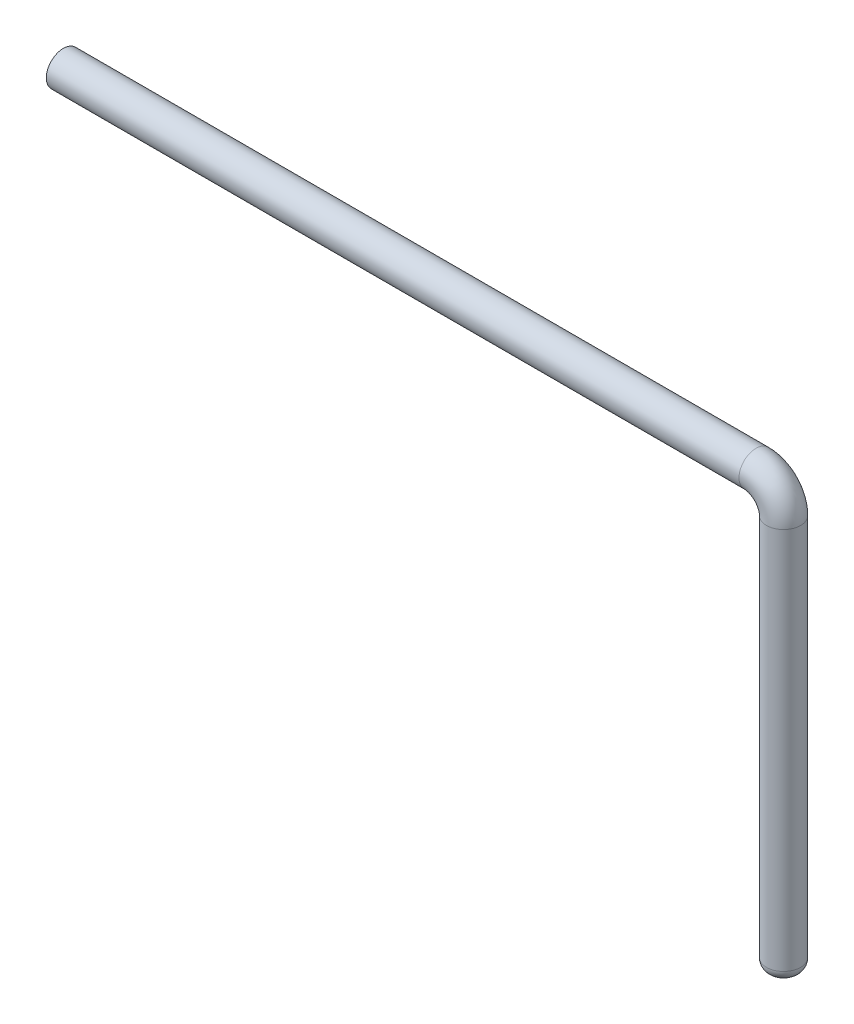
ISO-10303-21;
HEADER;
FILE_DESCRIPTION(('STEP AP214'),'2;1');
FILE_NAME('part.step','',(''),(''),'','','');
FILE_SCHEMA(('AUTOMOTIVE_DESIGN { 1 0 10303 214 1 1 1 1 }'));
ENDSEC;
DATA;
#1=APPLICATION_CONTEXT('core data for automotive mechanical design processes');
#2=APPLICATION_PROTOCOL_DEFINITION('international standard','automotive_design',2000,#1);
#3=PRODUCT_CONTEXT('',#1,'mechanical');
#4=PRODUCT('Part','Part','',(#3));
#5=PRODUCT_RELATED_PRODUCT_CATEGORY('part','',(#4));
#6=PRODUCT_DEFINITION_FORMATION('','',#4);
#7=PRODUCT_DEFINITION_CONTEXT('part definition',#1,'design');
#8=PRODUCT_DEFINITION('design','',#6,#7);
#9=PRODUCT_DEFINITION_SHAPE('','',#8);
#10=(LENGTH_UNIT() NAMED_UNIT(*) SI_UNIT(.MILLI.,.METRE.));
#11=(NAMED_UNIT(*) PLANE_ANGLE_UNIT() SI_UNIT($,.RADIAN.));
#12=(NAMED_UNIT(*) SI_UNIT($,.STERADIAN.) SOLID_ANGLE_UNIT());
#13=UNCERTAINTY_MEASURE_WITH_UNIT(LENGTH_MEASURE(1.E-05),#10,'distance_accuracy_value','');
#14=(GEOMETRIC_REPRESENTATION_CONTEXT(3) GLOBAL_UNCERTAINTY_ASSIGNED_CONTEXT((#13)) GLOBAL_UNIT_ASSIGNED_CONTEXT((#10,
#11,#12)) REPRESENTATION_CONTEXT('',''));
#15=CARTESIAN_POINT('',(0.,0.,0.));
#16=DIRECTION('',(0.,0.,1.));
#17=DIRECTION('',(1.,0.,0.));
#18=AXIS2_PLACEMENT_3D('',#15,#16,#17);
#19=CARTESIAN_POINT('',(51.4228571428571,34.0647619047619,0.));
#20=DIRECTION('',(-1.,0.,0.));
#21=DIRECTION('',(0.,0.,1.));
#22=AXIS2_PLACEMENT_3D('',#19,#20,#21);
#23=PLANE('',#22);
#24=CARTESIAN_POINT('',(51.4228571428571,34.0647619047619,0.));
#25=DIRECTION('',(-1.,0.,0.));
#26=DIRECTION('',(0.,0.,1.));
#27=AXIS2_PLACEMENT_3D('',#24,#25,#26);
#28=CIRCLE('',#27,0.310000000000005);
#29=CARTESIAN_POINT('',(51.4228571428571,34.0647619047619,0.310000000000005));
#30=VERTEX_POINT('',#29);
#31=EDGE_CURVE('E67',#30,#30,#28,.T.);
#32=ORIENTED_EDGE('',*,*,#31,.T.);
#33=EDGE_LOOP('',(#32));
#34=FACE_BOUND('',#33,.T.);
#35=ADVANCED_FACE('F47',(#34),#23,.T.);
#36=CARTESIAN_POINT('',(64.5028571428571,26.4147619047619,0.));
#37=DIRECTION('',(0.,1.,0.));
#38=DIRECTION('',(0.,0.,1.));
#39=AXIS2_PLACEMENT_3D('',#36,#37,#38);
#40=PLANE('',#39);
#41=CARTESIAN_POINT('',(64.5028571428571,26.4147619047619,0.));
#42=DIRECTION('',(0.,1.,0.));
#43=DIRECTION('',(0.,0.,1.));
#44=AXIS2_PLACEMENT_3D('',#41,#42,#43);
#45=CIRCLE('',#44,0.110000000000005);
#46=CARTESIAN_POINT('',(64.5028571428571,26.4147619047619,0.110000000000005));
#47=VERTEX_POINT('',#46);
#48=EDGE_CURVE('E11',#47,#47,#45,.F.);
#49=ORIENTED_EDGE('',*,*,#48,.T.);
#50=EDGE_LOOP('',(#49));
#51=FACE_BOUND('',#50,.T.);
#52=ADVANCED_FACE('F75',(#51),#40,.F.);
#53=CARTESIAN_POINT('',(51.4228571428571,34.0647619047619,0.));
#54=DIRECTION('',(1.,0.,0.));
#55=DIRECTION('',(0.,0.,-1.));
#56=AXIS2_PLACEMENT_3D('',#53,#54,#55);
#57=CYLINDRICAL_SURFACE('',#56,0.310000000000005);
#58=CARTESIAN_POINT('',(64.0028571428571,34.0647619047619,0.));
#59=DIRECTION('',(-1.,0.,0.));
#60=DIRECTION('',(0.,0.,1.));
#61=AXIS2_PLACEMENT_3D('',#58,#59,#60);
#62=CIRCLE('',#61,0.310000000000005);
#63=CARTESIAN_POINT('',(64.0028571428571,34.3747619047619,0.));
#64=VERTEX_POINT('',#63);
#65=EDGE_CURVE('E62',#64,#64,#62,.T.);
#66=ORIENTED_EDGE('',*,*,#65,.T.);
#67=EDGE_LOOP('',(#66));
#68=FACE_BOUND('',#67,.T.);
#69=ORIENTED_EDGE('',*,*,#31,.F.);
#70=EDGE_LOOP('',(#69));
#71=FACE_BOUND('',#70,.T.);
#72=ADVANCED_FACE('F72',(#68,#71),#57,.T.);
#73=CARTESIAN_POINT('',(64.0028571428571,33.5647619047619,0.));
#74=DIRECTION('',(0.,0.,-1.));
#75=DIRECTION('',(-1.,0.,0.));
#76=AXIS2_PLACEMENT_3D('',#73,#74,#75);
#77=TOROIDAL_SURFACE('',#76,0.5,0.310000000000005);
#78=CARTESIAN_POINT('',(64.5028571428571,33.5647619047619,0.));
#79=DIRECTION('',(0.,1.,0.));
#80=DIRECTION('',(0.,0.,1.));
#81=AXIS2_PLACEMENT_3D('',#78,#79,#80);
#82=CIRCLE('',#81,0.310000000000005);
#83=CARTESIAN_POINT('',(64.8128571428571,33.5647619047619,0.));
#84=VERTEX_POINT('',#83);
#85=EDGE_CURVE('E58',#84,#84,#82,.T.);
#86=CARTESIAN_POINT('',(64.0028571428571,33.5647619047619,0.));
#87=DIRECTION('',(0.,0.,-1.));
#88=DIRECTION('',(-1.,0.,0.));
#89=AXIS2_PLACEMENT_3D('',#86,#87,#88);
#90=CIRCLE('',#89,0.810000000000005);
#91=EDGE_CURVE('',#64,#84,#90,.T.);
#92=ORIENTED_EDGE('',*,*,#65,.F.);
#93=ORIENTED_EDGE('',*,*,#85,.T.);
#94=ORIENTED_EDGE('',*,*,#91,.T.);
#95=ORIENTED_EDGE('',*,*,#91,.F.);
#96=EDGE_LOOP('',(#92,#94,#93,#95));
#97=FACE_BOUND('',#96,.T.);
#98=ADVANCED_FACE('F74',(#97),#77,.T.);
#99=CARTESIAN_POINT('',(64.5028571428571,33.5647619047619,0.));
#100=DIRECTION('',(0.,-1.,0.));
#101=DIRECTION('',(0.,0.,-1.));
#102=AXIS2_PLACEMENT_3D('',#99,#100,#101);
#103=CYLINDRICAL_SURFACE('',#102,0.310000000000005);
#104=CARTESIAN_POINT('',(64.5028571428571,26.6147619047619,0.));
#105=DIRECTION('',(0.,1.,0.));
#106=DIRECTION('',(0.,0.,1.));
#107=AXIS2_PLACEMENT_3D('',#104,#105,#106);
#108=CIRCLE('',#107,0.310000000000005);
#109=CARTESIAN_POINT('',(64.5028571428571,26.6147619047619,0.310000000000005));
#110=VERTEX_POINT('',#109);
#111=EDGE_CURVE('E54',#110,#110,#108,.T.);
#112=ORIENTED_EDGE('',*,*,#111,.T.);
#113=EDGE_LOOP('',(#112));
#114=FACE_BOUND('',#113,.T.);
#115=ORIENTED_EDGE('',*,*,#85,.F.);
#116=EDGE_LOOP('',(#115));
#117=FACE_BOUND('',#116,.T.);
#118=ADVANCED_FACE('F82',(#114,#117),#103,.T.);
#119=CARTESIAN_POINT('',(64.5028571428571,26.6147619047619,0.));
#120=DIRECTION('',(0.,1.,0.));
#121=DIRECTION('',(0.,0.,1.));
#122=AXIS2_PLACEMENT_3D('',#119,#120,#121);
#123=DEGENERATE_TOROIDAL_SURFACE('',#122,0.110000000000005,0.2,.T.);
#124=ORIENTED_EDGE('',*,*,#48,.F.);
#125=EDGE_LOOP('',(#124));
#126=FACE_BOUND('',#125,.T.);
#127=ORIENTED_EDGE('',*,*,#111,.F.);
#128=EDGE_LOOP('',(#127));
#129=FACE_BOUND('',#128,.T.);
#130=ADVANCED_FACE('F49',(#126,#129),#123,.T.);
#131=CLOSED_SHELL('',(#35,#52,#72,#98,#118,#130));
#132=MANIFOLD_SOLID_BREP('B2',#131);
#133=ADVANCED_BREP_SHAPE_REPRESENTATION('',(#18,#132),#14);
#134=SHAPE_DEFINITION_REPRESENTATION(#9,#133);
ENDSEC;
END-ISO-10303-21;
